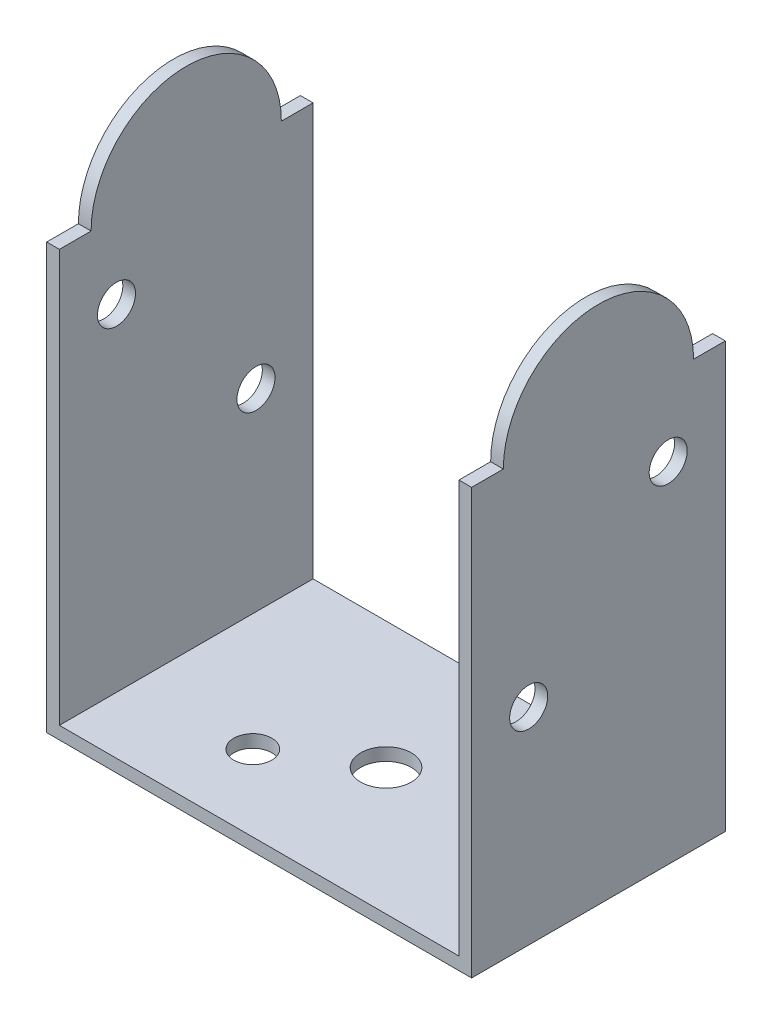
ISO-10303-21;
HEADER;
FILE_DESCRIPTION(('STEP AP214'),'2;1');
FILE_NAME('part.step','',(''),(''),'','','');
FILE_SCHEMA(('AUTOMOTIVE_DESIGN { 1 0 10303 214 1 1 1 1 }'));
ENDSEC;
DATA;
#1=APPLICATION_CONTEXT('core data for automotive mechanical design processes');
#2=APPLICATION_PROTOCOL_DEFINITION('international standard','automotive_design',2000,#1);
#3=PRODUCT_CONTEXT('',#1,'mechanical');
#4=PRODUCT('Part','Part','',(#3));
#5=PRODUCT_RELATED_PRODUCT_CATEGORY('part','',(#4));
#6=PRODUCT_DEFINITION_FORMATION('','',#4);
#7=PRODUCT_DEFINITION_CONTEXT('part definition',#1,'design');
#8=PRODUCT_DEFINITION('design','',#6,#7);
#9=PRODUCT_DEFINITION_SHAPE('','',#8);
#10=(LENGTH_UNIT() NAMED_UNIT(*) SI_UNIT(.MILLI.,.METRE.));
#11=(NAMED_UNIT(*) PLANE_ANGLE_UNIT() SI_UNIT($,.RADIAN.));
#12=(NAMED_UNIT(*) SI_UNIT($,.STERADIAN.) SOLID_ANGLE_UNIT());
#13=UNCERTAINTY_MEASURE_WITH_UNIT(LENGTH_MEASURE(1.E-05),#10,'distance_accuracy_value','');
#14=(GEOMETRIC_REPRESENTATION_CONTEXT(3) GLOBAL_UNCERTAINTY_ASSIGNED_CONTEXT((#13)) GLOBAL_UNIT_ASSIGNED_CONTEXT((#10,
#11,#12)) REPRESENTATION_CONTEXT('',''));
#15=CARTESIAN_POINT('',(0.,0.,0.));
#16=DIRECTION('',(0.,0.,1.));
#17=DIRECTION('',(1.,0.,0.));
#18=AXIS2_PLACEMENT_3D('',#15,#16,#17);
#19=CARTESIAN_POINT('',(33.5,82.,40.));
#20=DIRECTION('',(-1.,0.,0.));
#21=DIRECTION('',(0.,0.,1.));
#22=AXIS2_PLACEMENT_3D('',#19,#20,#21);
#23=PLANE('',#22);
#24=CARTESIAN_POINT('',(33.5,55.,9.));
#25=DIRECTION('',(1.,0.,0.));
#26=DIRECTION('',(0.,0.,-1.));
#27=AXIS2_PLACEMENT_3D('',#24,#25,#26);
#28=CIRCLE('',#27,3.);
#29=CARTESIAN_POINT('',(33.5,55.,6.));
#30=VERTEX_POINT('',#29);
#31=EDGE_CURVE('E172',#30,#30,#28,.T.);
#32=ORIENTED_EDGE('',*,*,#31,.F.);
#33=EDGE_LOOP('',(#32));
#34=FACE_BOUND('',#33,.T.);
#35=CARTESIAN_POINT('',(33.5,32.5,31.));
#36=DIRECTION('',(1.,0.,0.));
#37=DIRECTION('',(0.,0.,-1.));
#38=AXIS2_PLACEMENT_3D('',#35,#36,#37);
#39=CIRCLE('',#38,3.);
#40=CARTESIAN_POINT('',(33.5,32.5,28.));
#41=VERTEX_POINT('',#40);
#42=EDGE_CURVE('E159',#41,#41,#39,.T.);
#43=ORIENTED_EDGE('',*,*,#42,.F.);
#44=EDGE_LOOP('',(#43));
#45=FACE_BOUND('',#44,.T.);
#46=DIRECTION('',(0.,1.,0.));
#47=VECTOR('',#46,1.);
#48=CARTESIAN_POINT('',(33.5,82.,0.));
#49=LINE('',#48,#47);
#50=CARTESIAN_POINT('',(33.5,0.,0.));
#51=VERTEX_POINT('',#50);
#52=CARTESIAN_POINT('',(33.5,67.,0.));
#53=VERTEX_POINT('',#52);
#54=EDGE_CURVE('E210',#51,#53,#49,.T.);
#55=ORIENTED_EDGE('',*,*,#54,.T.);
#56=DIRECTION('',(0.,0.,-1.));
#57=VECTOR('',#56,1.);
#58=CARTESIAN_POINT('',(33.5,67.,0.));
#59=LINE('',#58,#57);
#60=CARTESIAN_POINT('',(33.5,67.,5.));
#61=VERTEX_POINT('',#60);
#62=EDGE_CURVE('E171',#61,#53,#59,.T.);
#63=ORIENTED_EDGE('',*,*,#62,.F.);
#64=CARTESIAN_POINT('',(33.5,67.,20.));
#65=DIRECTION('',(-1.,0.,0.));
#66=DIRECTION('',(0.,0.,1.));
#67=AXIS2_PLACEMENT_3D('',#64,#65,#66);
#68=CIRCLE('',#67,15.);
#69=CARTESIAN_POINT('',(33.5,67.,35.));
#70=VERTEX_POINT('',#69);
#71=EDGE_CURVE('E192',#70,#61,#68,.T.);
#72=ORIENTED_EDGE('',*,*,#71,.F.);
#73=DIRECTION('',(0.,0.,-1.));
#74=VECTOR('',#73,1.);
#75=CARTESIAN_POINT('',(33.5,67.,40.));
#76=LINE('',#75,#74);
#77=CARTESIAN_POINT('',(33.5,67.,40.));
#78=VERTEX_POINT('',#77);
#79=EDGE_CURVE('E188',#78,#70,#76,.T.);
#80=ORIENTED_EDGE('',*,*,#79,.F.);
#81=DIRECTION('',(0.,1.,0.));
#82=VECTOR('',#81,1.);
#83=CARTESIAN_POINT('',(33.5,82.,40.));
#84=LINE('',#83,#82);
#85=CARTESIAN_POINT('',(33.5,0.,40.));
#86=VERTEX_POINT('',#85);
#87=EDGE_CURVE('E228',#86,#78,#84,.T.);
#88=ORIENTED_EDGE('',*,*,#87,.F.);
#89=DIRECTION('',(0.,0.,-1.));
#90=VECTOR('',#89,1.);
#91=CARTESIAN_POINT('',(33.5,0.,40.));
#92=LINE('',#91,#90);
#93=EDGE_CURVE('E40',#86,#51,#92,.T.);
#94=ORIENTED_EDGE('',*,*,#93,.T.);
#95=EDGE_LOOP('',(#55,#63,#72,#80,#88,#94));
#96=FACE_BOUND('',#95,.T.);
#97=ADVANCED_FACE('F33',(#34,#45,#96),#23,.F.);
#98=CARTESIAN_POINT('',(31.5,1.99999999999999,40.));
#99=DIRECTION('',(1.,0.,0.));
#100=DIRECTION('',(0.,0.,-1.));
#101=AXIS2_PLACEMENT_3D('',#98,#99,#100);
#102=PLANE('',#101);
#103=CARTESIAN_POINT('',(31.5,55.,9.));
#104=DIRECTION('',(1.,0.,0.));
#105=DIRECTION('',(0.,0.,-1.));
#106=AXIS2_PLACEMENT_3D('',#103,#104,#105);
#107=CIRCLE('',#106,3.);
#108=CARTESIAN_POINT('',(31.5,55.,6.));
#109=VERTEX_POINT('',#108);
#110=EDGE_CURVE('E168',#109,#109,#107,.T.);
#111=ORIENTED_EDGE('',*,*,#110,.T.);
#112=EDGE_LOOP('',(#111));
#113=FACE_BOUND('',#112,.T.);
#114=CARTESIAN_POINT('',(31.5,32.5,31.));
#115=DIRECTION('',(1.,0.,0.));
#116=DIRECTION('',(0.,0.,-1.));
#117=AXIS2_PLACEMENT_3D('',#114,#115,#116);
#118=CIRCLE('',#117,3.);
#119=CARTESIAN_POINT('',(31.5,32.5,28.));
#120=VERTEX_POINT('',#119);
#121=EDGE_CURVE('E175',#120,#120,#118,.T.);
#122=ORIENTED_EDGE('',*,*,#121,.T.);
#123=EDGE_LOOP('',(#122));
#124=FACE_BOUND('',#123,.T.);
#125=CARTESIAN_POINT('',(31.5,67.,20.));
#126=DIRECTION('',(-1.,0.,0.));
#127=DIRECTION('',(0.,0.,1.));
#128=AXIS2_PLACEMENT_3D('',#125,#126,#127);
#129=CIRCLE('',#128,15.);
#130=CARTESIAN_POINT('',(31.5,67.,35.));
#131=VERTEX_POINT('',#130);
#132=CARTESIAN_POINT('',(31.5,67.,5.));
#133=VERTEX_POINT('',#132);
#134=EDGE_CURVE('E184',#131,#133,#129,.T.);
#135=ORIENTED_EDGE('',*,*,#134,.T.);
#136=DIRECTION('',(0.,0.,-1.));
#137=VECTOR('',#136,1.);
#138=CARTESIAN_POINT('',(31.5,67.,0.));
#139=LINE('',#138,#137);
#140=CARTESIAN_POINT('',(31.5,67.,0.));
#141=VERTEX_POINT('',#140);
#142=EDGE_CURVE('E180',#133,#141,#139,.T.);
#143=ORIENTED_EDGE('',*,*,#142,.T.);
#144=DIRECTION('',(0.,-1.,0.));
#145=VECTOR('',#144,1.);
#146=CARTESIAN_POINT('',(31.5,1.99999999999999,0.));
#147=LINE('',#146,#145);
#148=CARTESIAN_POINT('',(31.5,1.99999999999999,0.));
#149=VERTEX_POINT('',#148);
#150=EDGE_CURVE('E243',#141,#149,#147,.T.);
#151=ORIENTED_EDGE('',*,*,#150,.T.);
#152=DIRECTION('',(0.,0.,-1.));
#153=VECTOR('',#152,1.);
#154=CARTESIAN_POINT('',(31.5,1.99999999999999,40.));
#155=LINE('',#154,#153);
#156=CARTESIAN_POINT('',(31.5,1.99999999999999,40.));
#157=VERTEX_POINT('',#156);
#158=EDGE_CURVE('E253',#157,#149,#155,.T.);
#159=ORIENTED_EDGE('',*,*,#158,.F.);
#160=DIRECTION('',(0.,-1.,0.));
#161=VECTOR('',#160,1.);
#162=CARTESIAN_POINT('',(31.5,1.99999999999999,40.));
#163=LINE('',#162,#161);
#164=CARTESIAN_POINT('',(31.5,67.,40.));
#165=VERTEX_POINT('',#164);
#166=EDGE_CURVE('E231',#165,#157,#163,.T.);
#167=ORIENTED_EDGE('',*,*,#166,.F.);
#168=DIRECTION('',(0.,0.,-1.));
#169=VECTOR('',#168,1.);
#170=CARTESIAN_POINT('',(31.5,67.,40.));
#171=LINE('',#170,#169);
#172=EDGE_CURVE('E185',#165,#131,#171,.T.);
#173=ORIENTED_EDGE('',*,*,#172,.T.);
#174=EDGE_LOOP('',(#135,#143,#151,#159,#167,#173));
#175=FACE_BOUND('',#174,.T.);
#176=ADVANCED_FACE('F276',(#113,#124,#175),#102,.F.);
#177=CARTESIAN_POINT('',(-31.5,1.99999999999998,40.));
#178=DIRECTION('',(0.,-1.,0.));
#179=DIRECTION('',(1.,0.,0.));
#180=AXIS2_PLACEMENT_3D('',#177,#178,#179);
#181=PLANE('',#180);
#182=CARTESIAN_POINT('',(13.,2.,12.));
#183=DIRECTION('',(0.,-1.,0.));
#184=DIRECTION('',(1.,0.,0.));
#185=AXIS2_PLACEMENT_3D('',#182,#183,#184);
#186=CIRCLE('',#185,3.);
#187=CARTESIAN_POINT('',(16.,2.,12.));
#188=VERTEX_POINT('',#187);
#189=EDGE_CURVE('E207',#188,#188,#186,.T.);
#190=ORIENTED_EDGE('',*,*,#189,.T.);
#191=EDGE_LOOP('',(#190));
#192=FACE_BOUND('',#191,.T.);
#193=CARTESIAN_POINT('',(0.,2.,20.));
#194=DIRECTION('',(0.,-1.,0.));
#195=DIRECTION('',(1.,0.,0.));
#196=AXIS2_PLACEMENT_3D('',#193,#194,#195);
#197=CIRCLE('',#196,4.);
#198=CARTESIAN_POINT('',(4.,2.,20.));
#199=VERTEX_POINT('',#198);
#200=EDGE_CURVE('E217',#199,#199,#197,.T.);
#201=ORIENTED_EDGE('',*,*,#200,.T.);
#202=EDGE_LOOP('',(#201));
#203=FACE_BOUND('',#202,.T.);
#204=CARTESIAN_POINT('',(-13.,2.,28.));
#205=DIRECTION('',(0.,-1.,0.));
#206=DIRECTION('',(1.,0.,0.));
#207=AXIS2_PLACEMENT_3D('',#204,#205,#206);
#208=CIRCLE('',#207,3.);
#209=CARTESIAN_POINT('',(-9.99999999999999,2.,28.));
#210=VERTEX_POINT('',#209);
#211=EDGE_CURVE('E206',#210,#210,#208,.T.);
#212=ORIENTED_EDGE('',*,*,#211,.T.);
#213=EDGE_LOOP('',(#212));
#214=FACE_BOUND('',#213,.T.);
#215=DIRECTION('',(-1.,0.,0.));
#216=VECTOR('',#215,1.);
#217=CARTESIAN_POINT('',(-31.5,1.99999999999998,0.));
#218=LINE('',#217,#216);
#219=CARTESIAN_POINT('',(-31.5,1.99999999999998,0.));
#220=VERTEX_POINT('',#219);
#221=EDGE_CURVE('E245',#149,#220,#218,.T.);
#222=ORIENTED_EDGE('',*,*,#221,.T.);
#223=DIRECTION('',(0.,0.,-1.));
#224=VECTOR('',#223,1.);
#225=CARTESIAN_POINT('',(-31.5,1.99999999999998,40.));
#226=LINE('',#225,#224);
#227=CARTESIAN_POINT('',(-31.5,1.99999999999998,40.));
#228=VERTEX_POINT('',#227);
#229=EDGE_CURVE('E250',#228,#220,#226,.T.);
#230=ORIENTED_EDGE('',*,*,#229,.F.);
#231=DIRECTION('',(-1.,0.,0.));
#232=VECTOR('',#231,1.);
#233=CARTESIAN_POINT('',(-31.5,1.99999999999998,40.));
#234=LINE('',#233,#232);
#235=EDGE_CURVE('E233',#157,#228,#234,.T.);
#236=ORIENTED_EDGE('',*,*,#235,.F.);
#237=ORIENTED_EDGE('',*,*,#158,.T.);
#238=EDGE_LOOP('',(#222,#230,#236,#237));
#239=FACE_BOUND('',#238,.T.);
#240=ADVANCED_FACE('F293',(#192,#203,#214,#239),#181,.F.);
#241=CARTESIAN_POINT('',(-31.5,82.,40.));
#242=DIRECTION('',(-1.,0.,0.));
#243=DIRECTION('',(0.,-1.,0.));
#244=AXIS2_PLACEMENT_3D('',#241,#242,#243);
#245=PLANE('',#244);
#246=CARTESIAN_POINT('',(-31.5,32.5,9.00000000000001));
#247=DIRECTION('',(-1.,0.,0.));
#248=DIRECTION('',(0.,0.,1.));
#249=AXIS2_PLACEMENT_3D('',#246,#247,#248);
#250=CIRCLE('',#249,3.);
#251=CARTESIAN_POINT('',(-31.5,32.5,12.));
#252=VERTEX_POINT('',#251);
#253=EDGE_CURVE('E156',#252,#252,#250,.T.);
#254=ORIENTED_EDGE('',*,*,#253,.T.);
#255=EDGE_LOOP('',(#254));
#256=FACE_BOUND('',#255,.T.);
#257=CARTESIAN_POINT('',(-31.5,55.,31.));
#258=DIRECTION('',(-1.,0.,0.));
#259=DIRECTION('',(0.,0.,1.));
#260=AXIS2_PLACEMENT_3D('',#257,#258,#259);
#261=CIRCLE('',#260,3.);
#262=CARTESIAN_POINT('',(-31.5,55.,34.));
#263=VERTEX_POINT('',#262);
#264=EDGE_CURVE('E163',#263,#263,#261,.T.);
#265=ORIENTED_EDGE('',*,*,#264,.T.);
#266=EDGE_LOOP('',(#265));
#267=FACE_BOUND('',#266,.T.);
#268=CARTESIAN_POINT('',(-31.5,67.,20.));
#269=DIRECTION('',(1.,0.,0.));
#270=DIRECTION('',(0.,0.,-1.));
#271=AXIS2_PLACEMENT_3D('',#268,#269,#270);
#272=CIRCLE('',#271,15.);
#273=CARTESIAN_POINT('',(-31.5,67.,5.));
#274=VERTEX_POINT('',#273);
#275=CARTESIAN_POINT('',(-31.5,67.,35.));
#276=VERTEX_POINT('',#275);
#277=EDGE_CURVE('E47',#274,#276,#272,.T.);
#278=ORIENTED_EDGE('',*,*,#277,.T.);
#279=DIRECTION('',(0.,0.,1.));
#280=VECTOR('',#279,1.);
#281=CARTESIAN_POINT('',(-31.5,67.,40.));
#282=LINE('',#281,#280);
#283=CARTESIAN_POINT('',(-31.5,67.,40.));
#284=VERTEX_POINT('',#283);
#285=EDGE_CURVE('E144',#276,#284,#282,.T.);
#286=ORIENTED_EDGE('',*,*,#285,.T.);
#287=DIRECTION('',(0.,1.,0.));
#288=VECTOR('',#287,1.);
#289=CARTESIAN_POINT('',(-31.5,82.,40.));
#290=LINE('',#289,#288);
#291=EDGE_CURVE('E235',#228,#284,#290,.T.);
#292=ORIENTED_EDGE('',*,*,#291,.F.);
#293=ORIENTED_EDGE('',*,*,#229,.T.);
#294=DIRECTION('',(0.,1.,0.));
#295=VECTOR('',#294,1.);
#296=CARTESIAN_POINT('',(-31.5,82.,0.));
#297=LINE('',#296,#295);
#298=CARTESIAN_POINT('',(-31.5,67.,0.));
#299=VERTEX_POINT('',#298);
#300=EDGE_CURVE('E129',#220,#299,#297,.T.);
#301=ORIENTED_EDGE('',*,*,#300,.T.);
#302=DIRECTION('',(0.,0.,1.));
#303=VECTOR('',#302,1.);
#304=CARTESIAN_POINT('',(-31.5,67.,0.));
#305=LINE('',#304,#303);
#306=EDGE_CURVE('E138',#299,#274,#305,.T.);
#307=ORIENTED_EDGE('',*,*,#306,.T.);
#308=EDGE_LOOP('',(#278,#286,#292,#293,#301,#307));
#309=FACE_BOUND('',#308,.T.);
#310=ADVANCED_FACE('F289',(#256,#267,#309),#245,.F.);
#311=CARTESIAN_POINT('',(-33.5,0.,40.));
#312=DIRECTION('',(1.,0.,0.));
#313=DIRECTION('',(0.,0.,-1.));
#314=AXIS2_PLACEMENT_3D('',#311,#312,#313);
#315=PLANE('',#314);
#316=CARTESIAN_POINT('',(-33.5,32.5,9.00000000000001));
#317=DIRECTION('',(-1.,0.,0.));
#318=DIRECTION('',(0.,0.,1.));
#319=AXIS2_PLACEMENT_3D('',#316,#317,#318);
#320=CIRCLE('',#319,3.);
#321=CARTESIAN_POINT('',(-33.5,32.5,12.));
#322=VERTEX_POINT('',#321);
#323=EDGE_CURVE('E160',#322,#322,#320,.T.);
#324=ORIENTED_EDGE('',*,*,#323,.F.);
#325=EDGE_LOOP('',(#324));
#326=FACE_BOUND('',#325,.T.);
#327=CARTESIAN_POINT('',(-33.5,55.,31.));
#328=DIRECTION('',(-1.,0.,0.));
#329=DIRECTION('',(0.,0.,1.));
#330=AXIS2_PLACEMENT_3D('',#327,#328,#329);
#331=CIRCLE('',#330,3.);
#332=CARTESIAN_POINT('',(-33.5,55.,34.));
#333=VERTEX_POINT('',#332);
#334=EDGE_CURVE('E155',#333,#333,#331,.T.);
#335=ORIENTED_EDGE('',*,*,#334,.F.);
#336=EDGE_LOOP('',(#335));
#337=FACE_BOUND('',#336,.T.);
#338=DIRECTION('',(0.,-1.,0.));
#339=VECTOR('',#338,1.);
#340=CARTESIAN_POINT('',(-33.5,0.,40.));
#341=LINE('',#340,#339);
#342=CARTESIAN_POINT('',(-33.5,67.,40.));
#343=VERTEX_POINT('',#342);
#344=CARTESIAN_POINT('',(-33.5,0.,40.));
#345=VERTEX_POINT('',#344);
#346=EDGE_CURVE('E238',#343,#345,#341,.T.);
#347=ORIENTED_EDGE('',*,*,#346,.F.);
#348=DIRECTION('',(0.,0.,1.));
#349=VECTOR('',#348,1.);
#350=CARTESIAN_POINT('',(-33.5,67.,40.));
#351=LINE('',#350,#349);
#352=CARTESIAN_POINT('',(-33.5,67.,35.));
#353=VERTEX_POINT('',#352);
#354=EDGE_CURVE('E139',#353,#343,#351,.T.);
#355=ORIENTED_EDGE('',*,*,#354,.F.);
#356=CARTESIAN_POINT('',(-33.5,67.,20.));
#357=DIRECTION('',(1.,0.,0.));
#358=DIRECTION('',(0.,0.,-1.));
#359=AXIS2_PLACEMENT_3D('',#356,#357,#358);
#360=CIRCLE('',#359,15.);
#361=CARTESIAN_POINT('',(-33.5,67.,5.));
#362=VERTEX_POINT('',#361);
#363=EDGE_CURVE('E11',#353,#362,#360,.F.);
#364=ORIENTED_EDGE('',*,*,#363,.T.);
#365=DIRECTION('',(0.,0.,1.));
#366=VECTOR('',#365,1.);
#367=CARTESIAN_POINT('',(-33.5,67.,0.));
#368=LINE('',#367,#366);
#369=CARTESIAN_POINT('',(-33.5,67.,0.));
#370=VERTEX_POINT('',#369);
#371=EDGE_CURVE('E132',#370,#362,#368,.T.);
#372=ORIENTED_EDGE('',*,*,#371,.F.);
#373=DIRECTION('',(0.,-1.,0.));
#374=VECTOR('',#373,1.);
#375=CARTESIAN_POINT('',(-33.5,0.,0.));
#376=LINE('',#375,#374);
#377=CARTESIAN_POINT('',(-33.5,0.,0.));
#378=VERTEX_POINT('',#377);
#379=EDGE_CURVE('E117',#370,#378,#376,.T.);
#380=ORIENTED_EDGE('',*,*,#379,.T.);
#381=DIRECTION('',(0.,0.,-1.));
#382=VECTOR('',#381,1.);
#383=CARTESIAN_POINT('',(-33.5,0.,40.));
#384=LINE('',#383,#382);
#385=EDGE_CURVE('E240',#345,#378,#384,.T.);
#386=ORIENTED_EDGE('',*,*,#385,.F.);
#387=EDGE_LOOP('',(#347,#355,#364,#372,#380,#386));
#388=FACE_BOUND('',#387,.T.);
#389=ADVANCED_FACE('F134',(#326,#337,#388),#315,.F.);
#390=CARTESIAN_POINT('',(0.,0.,40.));
#391=DIRECTION('',(0.,1.,0.));
#392=DIRECTION('',(-1.,0.,0.));
#393=AXIS2_PLACEMENT_3D('',#390,#391,#392);
#394=PLANE('',#393);
#395=CARTESIAN_POINT('',(13.,0.,12.));
#396=DIRECTION('',(0.,-1.,0.));
#397=DIRECTION('',(1.,0.,0.));
#398=AXIS2_PLACEMENT_3D('',#395,#396,#397);
#399=CIRCLE('',#398,3.);
#400=CARTESIAN_POINT('',(16.,0.,12.));
#401=VERTEX_POINT('',#400);
#402=EDGE_CURVE('E211',#401,#401,#399,.T.);
#403=ORIENTED_EDGE('',*,*,#402,.F.);
#404=EDGE_LOOP('',(#403));
#405=FACE_BOUND('',#404,.T.);
#406=CARTESIAN_POINT('',(0.,0.,20.));
#407=DIRECTION('',(0.,-1.,0.));
#408=DIRECTION('',(1.,0.,0.));
#409=AXIS2_PLACEMENT_3D('',#406,#407,#408);
#410=CIRCLE('',#409,4.);
#411=CARTESIAN_POINT('',(4.,0.,20.));
#412=VERTEX_POINT('',#411);
#413=EDGE_CURVE('E214',#412,#412,#410,.T.);
#414=ORIENTED_EDGE('',*,*,#413,.F.);
#415=EDGE_LOOP('',(#414));
#416=FACE_BOUND('',#415,.T.);
#417=CARTESIAN_POINT('',(-13.,0.,28.));
#418=DIRECTION('',(0.,-1.,0.));
#419=DIRECTION('',(1.,0.,0.));
#420=AXIS2_PLACEMENT_3D('',#417,#418,#419);
#421=CIRCLE('',#420,3.);
#422=CARTESIAN_POINT('',(-9.99999999999999,0.,28.));
#423=VERTEX_POINT('',#422);
#424=EDGE_CURVE('E220',#423,#423,#421,.T.);
#425=ORIENTED_EDGE('',*,*,#424,.F.);
#426=EDGE_LOOP('',(#425));
#427=FACE_BOUND('',#426,.T.);
#428=DIRECTION('',(1.,0.,0.));
#429=VECTOR('',#428,1.);
#430=CARTESIAN_POINT('',(0.,0.,0.));
#431=LINE('',#430,#429);
#432=EDGE_CURVE('E125',#378,#51,#431,.T.);
#433=ORIENTED_EDGE('',*,*,#432,.T.);
#434=ORIENTED_EDGE('',*,*,#93,.F.);
#435=DIRECTION('',(1.,0.,0.));
#436=VECTOR('',#435,1.);
#437=CARTESIAN_POINT('',(33.5,0.,40.));
#438=LINE('',#437,#436);
#439=EDGE_CURVE('E225',#345,#86,#438,.T.);
#440=ORIENTED_EDGE('',*,*,#439,.F.);
#441=ORIENTED_EDGE('',*,*,#385,.T.);
#442=EDGE_LOOP('',(#433,#434,#440,#441));
#443=FACE_BOUND('',#442,.T.);
#444=ADVANCED_FACE('F261',(#405,#416,#427,#443),#394,.F.);
#445=CARTESIAN_POINT('',(0.,0.,40.));
#446=DIRECTION('',(0.,0.,-1.));
#447=DIRECTION('',(-1.,0.,0.));
#448=AXIS2_PLACEMENT_3D('',#445,#446,#447);
#449=PLANE('',#448);
#450=ORIENTED_EDGE('',*,*,#291,.T.);
#451=DIRECTION('',(1.,0.,0.));
#452=VECTOR('',#451,1.);
#453=CARTESIAN_POINT('',(-258.743153544615,67.,40.));
#454=LINE('',#453,#452);
#455=EDGE_CURVE('E152',#343,#284,#454,.T.);
#456=ORIENTED_EDGE('',*,*,#455,.F.);
#457=ORIENTED_EDGE('',*,*,#346,.T.);
#458=ORIENTED_EDGE('',*,*,#439,.T.);
#459=ORIENTED_EDGE('',*,*,#87,.T.);
#460=DIRECTION('',(-1.,0.,0.));
#461=VECTOR('',#460,1.);
#462=CARTESIAN_POINT('',(174.993153544615,67.,40.));
#463=LINE('',#462,#461);
#464=EDGE_CURVE('E183',#78,#165,#463,.T.);
#465=ORIENTED_EDGE('',*,*,#464,.T.);
#466=ORIENTED_EDGE('',*,*,#166,.T.);
#467=ORIENTED_EDGE('',*,*,#235,.T.);
#468=EDGE_LOOP('',(#450,#456,#457,#458,#459,#465,#466,#467));
#469=FACE_BOUND('',#468,.T.);
#470=ADVANCED_FACE('F280',(#469),#449,.F.);
#471=CARTESIAN_POINT('',(0.,0.,0.));
#472=DIRECTION('',(0.,0.,-1.));
#473=DIRECTION('',(-1.,0.,0.));
#474=AXIS2_PLACEMENT_3D('',#471,#472,#473);
#475=PLANE('',#474);
#476=DIRECTION('',(1.,0.,0.));
#477=VECTOR('',#476,1.);
#478=CARTESIAN_POINT('',(-258.743153544615,67.,0.));
#479=LINE('',#478,#477);
#480=EDGE_CURVE('E122',#370,#299,#479,.T.);
#481=ORIENTED_EDGE('',*,*,#480,.T.);
#482=ORIENTED_EDGE('',*,*,#300,.F.);
#483=ORIENTED_EDGE('',*,*,#221,.F.);
#484=ORIENTED_EDGE('',*,*,#150,.F.);
#485=DIRECTION('',(-1.,0.,0.));
#486=VECTOR('',#485,1.);
#487=CARTESIAN_POINT('',(174.993153544615,67.,0.));
#488=LINE('',#487,#486);
#489=EDGE_CURVE('E203',#53,#141,#488,.T.);
#490=ORIENTED_EDGE('',*,*,#489,.F.);
#491=ORIENTED_EDGE('',*,*,#54,.F.);
#492=ORIENTED_EDGE('',*,*,#432,.F.);
#493=ORIENTED_EDGE('',*,*,#379,.F.);
#494=EDGE_LOOP('',(#481,#482,#483,#484,#490,#491,#492,#493));
#495=FACE_BOUND('',#494,.T.);
#496=ADVANCED_FACE('F119',(#495),#475,.T.);
#497=CARTESIAN_POINT('',(-13.,2.,28.));
#498=DIRECTION('',(0.,-1.,0.));
#499=DIRECTION('',(1.,0.,0.));
#500=AXIS2_PLACEMENT_3D('',#497,#498,#499);
#501=CYLINDRICAL_SURFACE('',#500,3.);
#502=ORIENTED_EDGE('',*,*,#211,.F.);
#503=EDGE_LOOP('',(#502));
#504=FACE_BOUND('',#503,.T.);
#505=ORIENTED_EDGE('',*,*,#424,.T.);
#506=EDGE_LOOP('',(#505));
#507=FACE_BOUND('',#506,.T.);
#508=ADVANCED_FACE('F340',(#504,#507),#501,.F.);
#509=CARTESIAN_POINT('',(0.,2.,20.));
#510=DIRECTION('',(0.,-1.,0.));
#511=DIRECTION('',(1.,0.,0.));
#512=AXIS2_PLACEMENT_3D('',#509,#510,#511);
#513=CYLINDRICAL_SURFACE('',#512,4.);
#514=ORIENTED_EDGE('',*,*,#200,.F.);
#515=EDGE_LOOP('',(#514));
#516=FACE_BOUND('',#515,.T.);
#517=ORIENTED_EDGE('',*,*,#413,.T.);
#518=EDGE_LOOP('',(#517));
#519=FACE_BOUND('',#518,.T.);
#520=ADVANCED_FACE('F336',(#516,#519),#513,.F.);
#521=CARTESIAN_POINT('',(13.,2.,12.));
#522=DIRECTION('',(0.,-1.,0.));
#523=DIRECTION('',(1.,0.,0.));
#524=AXIS2_PLACEMENT_3D('',#521,#522,#523);
#525=CYLINDRICAL_SURFACE('',#524,3.);
#526=ORIENTED_EDGE('',*,*,#189,.F.);
#527=EDGE_LOOP('',(#526));
#528=FACE_BOUND('',#527,.T.);
#529=ORIENTED_EDGE('',*,*,#402,.T.);
#530=EDGE_LOOP('',(#529));
#531=FACE_BOUND('',#530,.T.);
#532=ADVANCED_FACE('F331',(#528,#531),#525,.F.);
#533=CARTESIAN_POINT('',(174.993153544615,67.,20.));
#534=DIRECTION('',(-1.,0.,0.));
#535=DIRECTION('',(0.,0.,1.));
#536=AXIS2_PLACEMENT_3D('',#533,#534,#535);
#537=CYLINDRICAL_SURFACE('',#536,15.);
#538=ORIENTED_EDGE('',*,*,#71,.T.);
#539=DIRECTION('',(-1.,0.,0.));
#540=VECTOR('',#539,1.);
#541=CARTESIAN_POINT('',(174.993153544615,67.,5.));
#542=LINE('',#541,#540);
#543=EDGE_CURVE('E200',#61,#133,#542,.T.);
#544=ORIENTED_EDGE('',*,*,#543,.T.);
#545=ORIENTED_EDGE('',*,*,#134,.F.);
#546=DIRECTION('',(-1.,0.,0.));
#547=VECTOR('',#546,1.);
#548=CARTESIAN_POINT('',(174.993153544615,67.,35.));
#549=LINE('',#548,#547);
#550=EDGE_CURVE('E197',#70,#131,#549,.T.);
#551=ORIENTED_EDGE('',*,*,#550,.F.);
#552=EDGE_LOOP('',(#538,#544,#545,#551));
#553=FACE_BOUND('',#552,.T.);
#554=ADVANCED_FACE('F273',(#553),#537,.T.);
#555=CARTESIAN_POINT('',(174.993153544615,67.,0.));
#556=DIRECTION('',(0.,-1.,0.));
#557=DIRECTION('',(0.,0.,-1.));
#558=AXIS2_PLACEMENT_3D('',#555,#556,#557);
#559=PLANE('',#558);
#560=ORIENTED_EDGE('',*,*,#62,.T.);
#561=ORIENTED_EDGE('',*,*,#489,.T.);
#562=ORIENTED_EDGE('',*,*,#142,.F.);
#563=ORIENTED_EDGE('',*,*,#543,.F.);
#564=EDGE_LOOP('',(#560,#561,#562,#563));
#565=FACE_BOUND('',#564,.T.);
#566=ADVANCED_FACE('F265',(#565),#559,.F.);
#567=CARTESIAN_POINT('',(174.993153544615,67.,40.));
#568=DIRECTION('',(0.,-1.,0.));
#569=DIRECTION('',(0.,0.,-1.));
#570=AXIS2_PLACEMENT_3D('',#567,#568,#569);
#571=PLANE('',#570);
#572=ORIENTED_EDGE('',*,*,#79,.T.);
#573=ORIENTED_EDGE('',*,*,#550,.T.);
#574=ORIENTED_EDGE('',*,*,#172,.F.);
#575=ORIENTED_EDGE('',*,*,#464,.F.);
#576=EDGE_LOOP('',(#572,#573,#574,#575));
#577=FACE_BOUND('',#576,.T.);
#578=ADVANCED_FACE('F271',(#577),#571,.F.);
#579=CARTESIAN_POINT('',(31.5,32.5,31.));
#580=DIRECTION('',(1.,0.,0.));
#581=DIRECTION('',(0.,0.,-1.));
#582=AXIS2_PLACEMENT_3D('',#579,#580,#581);
#583=CYLINDRICAL_SURFACE('',#582,3.);
#584=ORIENTED_EDGE('',*,*,#121,.F.);
#585=EDGE_LOOP('',(#584));
#586=FACE_BOUND('',#585,.T.);
#587=ORIENTED_EDGE('',*,*,#42,.T.);
#588=EDGE_LOOP('',(#587));
#589=FACE_BOUND('',#588,.T.);
#590=ADVANCED_FACE('F313',(#586,#589),#583,.F.);
#591=CARTESIAN_POINT('',(31.5,55.,9.));
#592=DIRECTION('',(1.,0.,0.));
#593=DIRECTION('',(0.,0.,-1.));
#594=AXIS2_PLACEMENT_3D('',#591,#592,#593);
#595=CYLINDRICAL_SURFACE('',#594,3.);
#596=ORIENTED_EDGE('',*,*,#110,.F.);
#597=EDGE_LOOP('',(#596));
#598=FACE_BOUND('',#597,.T.);
#599=ORIENTED_EDGE('',*,*,#31,.T.);
#600=EDGE_LOOP('',(#599));
#601=FACE_BOUND('',#600,.T.);
#602=ADVANCED_FACE('F315',(#598,#601),#595,.F.);
#603=CARTESIAN_POINT('',(-31.5,55.,31.));
#604=DIRECTION('',(-1.,0.,0.));
#605=DIRECTION('',(0.,0.,1.));
#606=AXIS2_PLACEMENT_3D('',#603,#604,#605);
#607=CYLINDRICAL_SURFACE('',#606,3.);
#608=ORIENTED_EDGE('',*,*,#264,.F.);
#609=EDGE_LOOP('',(#608));
#610=FACE_BOUND('',#609,.T.);
#611=ORIENTED_EDGE('',*,*,#334,.T.);
#612=EDGE_LOOP('',(#611));
#613=FACE_BOUND('',#612,.T.);
#614=ADVANCED_FACE('F322',(#610,#613),#607,.F.);
#615=CARTESIAN_POINT('',(-31.5,32.5,9.00000000000001));
#616=DIRECTION('',(-1.,0.,0.));
#617=DIRECTION('',(0.,0.,1.));
#618=AXIS2_PLACEMENT_3D('',#615,#616,#617);
#619=CYLINDRICAL_SURFACE('',#618,3.);
#620=ORIENTED_EDGE('',*,*,#253,.F.);
#621=EDGE_LOOP('',(#620));
#622=FACE_BOUND('',#621,.T.);
#623=ORIENTED_EDGE('',*,*,#323,.T.);
#624=EDGE_LOOP('',(#623));
#625=FACE_BOUND('',#624,.T.);
#626=ADVANCED_FACE('F361',(#622,#625),#619,.F.);
#627=CARTESIAN_POINT('',(-258.743153544615,67.,20.));
#628=DIRECTION('',(1.,0.,0.));
#629=DIRECTION('',(0.,0.,-1.));
#630=AXIS2_PLACEMENT_3D('',#627,#628,#629);
#631=CYLINDRICAL_SURFACE('',#630,15.);
#632=DIRECTION('',(1.,0.,0.));
#633=VECTOR('',#632,1.);
#634=CARTESIAN_POINT('',(-258.743153544615,67.,5.));
#635=LINE('',#634,#633);
#636=EDGE_CURVE('E143',#362,#274,#635,.T.);
#637=ORIENTED_EDGE('',*,*,#636,.F.);
#638=ORIENTED_EDGE('',*,*,#363,.F.);
#639=DIRECTION('',(1.,0.,0.));
#640=VECTOR('',#639,1.);
#641=CARTESIAN_POINT('',(-258.743153544615,67.,35.));
#642=LINE('',#641,#640);
#643=EDGE_CURVE('E146',#353,#276,#642,.T.);
#644=ORIENTED_EDGE('',*,*,#643,.T.);
#645=ORIENTED_EDGE('',*,*,#277,.F.);
#646=EDGE_LOOP('',(#637,#638,#644,#645));
#647=FACE_BOUND('',#646,.T.);
#648=ADVANCED_FACE('F290',(#647),#631,.T.);
#649=CARTESIAN_POINT('',(-258.743153544615,67.,40.));
#650=DIRECTION('',(0.,-1.,0.));
#651=DIRECTION('',(0.,0.,-1.));
#652=AXIS2_PLACEMENT_3D('',#649,#650,#651);
#653=PLANE('',#652);
#654=ORIENTED_EDGE('',*,*,#354,.T.);
#655=ORIENTED_EDGE('',*,*,#455,.T.);
#656=ORIENTED_EDGE('',*,*,#285,.F.);
#657=ORIENTED_EDGE('',*,*,#643,.F.);
#658=EDGE_LOOP('',(#654,#655,#656,#657));
#659=FACE_BOUND('',#658,.T.);
#660=ADVANCED_FACE('F285',(#659),#653,.F.);
#661=CARTESIAN_POINT('',(-258.743153544615,67.,0.));
#662=DIRECTION('',(0.,-1.,0.));
#663=DIRECTION('',(0.,0.,-1.));
#664=AXIS2_PLACEMENT_3D('',#661,#662,#663);
#665=PLANE('',#664);
#666=ORIENTED_EDGE('',*,*,#371,.T.);
#667=ORIENTED_EDGE('',*,*,#636,.T.);
#668=ORIENTED_EDGE('',*,*,#306,.F.);
#669=ORIENTED_EDGE('',*,*,#480,.F.);
#670=EDGE_LOOP('',(#666,#667,#668,#669));
#671=FACE_BOUND('',#670,.T.);
#672=ADVANCED_FACE('F142',(#671),#665,.F.);
#673=CLOSED_SHELL('',(#97,#176,#240,#310,#389,#444,#470,#496,#508,#520,#532,#554,#566,#578,#590,
#602,#614,#626,#648,#660,#672));
#674=MANIFOLD_SOLID_BREP('B2',#673);
#675=ADVANCED_BREP_SHAPE_REPRESENTATION('',(#18,#674),#14);
#676=SHAPE_DEFINITION_REPRESENTATION(#9,#675);
ENDSEC;
END-ISO-10303-21;
